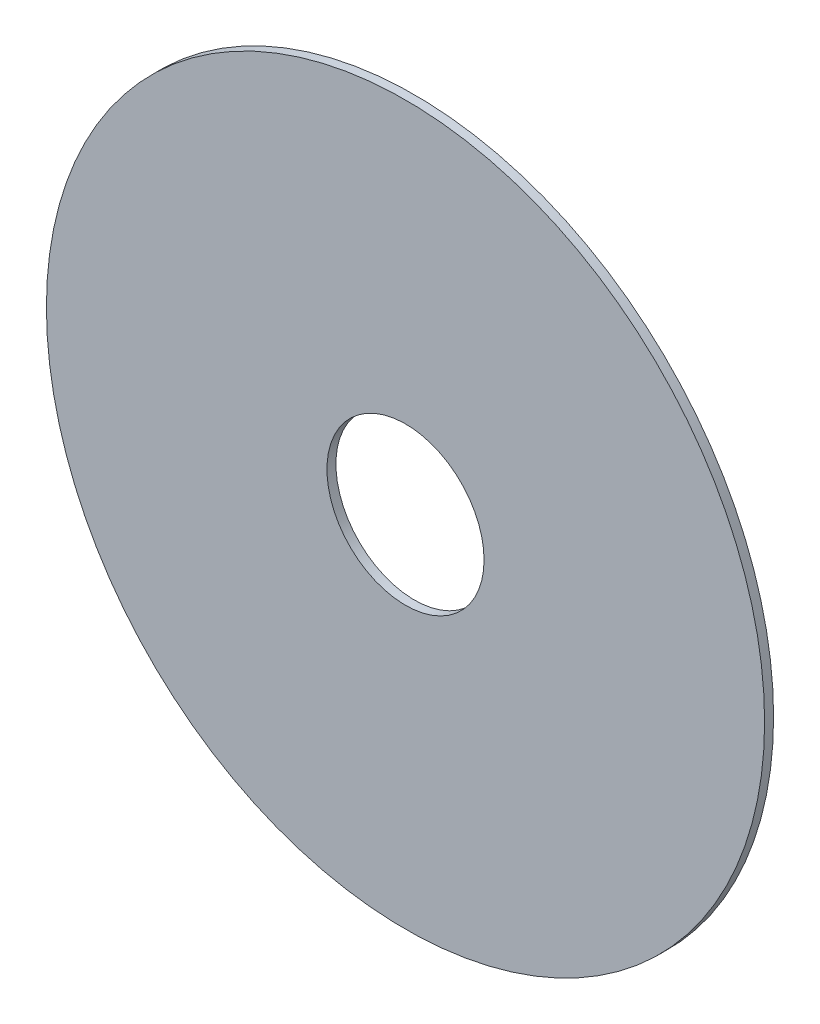
ISO-10303-21;
HEADER;
FILE_DESCRIPTION(('STEP AP214'),'2;1');
FILE_NAME('part.step','',(''),(''),'','','');
FILE_SCHEMA(('AUTOMOTIVE_DESIGN { 1 0 10303 214 1 1 1 1 }'));
ENDSEC;
DATA;
#1=APPLICATION_CONTEXT('core data for automotive mechanical design processes');
#2=APPLICATION_PROTOCOL_DEFINITION('international standard','automotive_design',2000,#1);
#3=PRODUCT_CONTEXT('',#1,'mechanical');
#4=PRODUCT('Part','Part','',(#3));
#5=PRODUCT_RELATED_PRODUCT_CATEGORY('part','',(#4));
#6=PRODUCT_DEFINITION_FORMATION('','',#4);
#7=PRODUCT_DEFINITION_CONTEXT('part definition',#1,'design');
#8=PRODUCT_DEFINITION('design','',#6,#7);
#9=PRODUCT_DEFINITION_SHAPE('','',#8);
#10=(LENGTH_UNIT() NAMED_UNIT(*) SI_UNIT(.MILLI.,.METRE.));
#11=(NAMED_UNIT(*) PLANE_ANGLE_UNIT() SI_UNIT($,.RADIAN.));
#12=(NAMED_UNIT(*) SI_UNIT($,.STERADIAN.) SOLID_ANGLE_UNIT());
#13=UNCERTAINTY_MEASURE_WITH_UNIT(LENGTH_MEASURE(1.E-05),#10,'distance_accuracy_value','');
#14=(GEOMETRIC_REPRESENTATION_CONTEXT(3) GLOBAL_UNCERTAINTY_ASSIGNED_CONTEXT((#13)) GLOBAL_UNIT_ASSIGNED_CONTEXT((#10,
#11,#12)) REPRESENTATION_CONTEXT('',''));
#15=CARTESIAN_POINT('',(0.,0.,0.));
#16=DIRECTION('',(0.,0.,1.));
#17=DIRECTION('',(1.,0.,0.));
#18=AXIS2_PLACEMENT_3D('',#15,#16,#17);
#19=CARTESIAN_POINT('',(0.,0.,2.));
#20=DIRECTION('',(0.,0.,-1.));
#21=DIRECTION('',(-1.,0.,0.));
#22=AXIS2_PLACEMENT_3D('',#19,#20,#21);
#23=CYLINDRICAL_SURFACE('',#22,80.);
#24=CARTESIAN_POINT('',(0.,0.,2.));
#25=DIRECTION('',(0.,0.,1.));
#26=DIRECTION('',(1.,0.,0.));
#27=AXIS2_PLACEMENT_3D('',#24,#25,#26);
#28=CIRCLE('',#27,80.);
#29=CARTESIAN_POINT('',(80.,0.,2.));
#30=VERTEX_POINT('',#29);
#31=EDGE_CURVE('E10',#30,#30,#28,.T.);
#32=ORIENTED_EDGE('',*,*,#31,.F.);
#33=EDGE_LOOP('',(#32));
#34=FACE_BOUND('',#33,.T.);
#35=CARTESIAN_POINT('',(0.,0.,0.));
#36=DIRECTION('',(0.,0.,1.));
#37=DIRECTION('',(1.,0.,0.));
#38=AXIS2_PLACEMENT_3D('',#35,#36,#37);
#39=CIRCLE('',#38,80.);
#40=CARTESIAN_POINT('',(80.,0.,0.));
#41=VERTEX_POINT('',#40);
#42=EDGE_CURVE('E37',#41,#41,#39,.T.);
#43=ORIENTED_EDGE('',*,*,#42,.T.);
#44=EDGE_LOOP('',(#43));
#45=FACE_BOUND('',#44,.T.);
#46=ADVANCED_FACE('F34',(#34,#45),#23,.T.);
#47=CARTESIAN_POINT('',(0.,0.,2.));
#48=DIRECTION('',(0.,0.,1.));
#49=DIRECTION('',(1.,0.,0.));
#50=AXIS2_PLACEMENT_3D('',#47,#48,#49);
#51=PLANE('',#50);
#52=CARTESIAN_POINT('',(0.,0.,2.));
#53=DIRECTION('',(0.,0.,1.));
#54=DIRECTION('',(1.,0.,0.));
#55=AXIS2_PLACEMENT_3D('',#52,#53,#54);
#56=CIRCLE('',#55,17.5);
#57=CARTESIAN_POINT('',(17.5,0.,2.));
#58=VERTEX_POINT('',#57);
#59=EDGE_CURVE('E46',#58,#58,#56,.T.);
#60=ORIENTED_EDGE('',*,*,#59,.F.);
#61=EDGE_LOOP('',(#60));
#62=FACE_BOUND('',#61,.T.);
#63=ORIENTED_EDGE('',*,*,#31,.T.);
#64=EDGE_LOOP('',(#63));
#65=FACE_BOUND('',#64,.T.);
#66=ADVANCED_FACE('F61',(#62,#65),#51,.T.);
#67=CARTESIAN_POINT('',(0.,0.,0.));
#68=DIRECTION('',(0.,0.,1.));
#69=DIRECTION('',(1.,0.,0.));
#70=AXIS2_PLACEMENT_3D('',#67,#68,#69);
#71=PLANE('',#70);
#72=CARTESIAN_POINT('',(0.,0.,0.));
#73=DIRECTION('',(0.,0.,1.));
#74=DIRECTION('',(1.,0.,0.));
#75=AXIS2_PLACEMENT_3D('',#72,#73,#74);
#76=CIRCLE('',#75,17.5);
#77=CARTESIAN_POINT('',(17.5,0.,0.));
#78=VERTEX_POINT('',#77);
#79=EDGE_CURVE('E44',#78,#78,#76,.T.);
#80=ORIENTED_EDGE('',*,*,#79,.T.);
#81=EDGE_LOOP('',(#80));
#82=FACE_BOUND('',#81,.T.);
#83=ORIENTED_EDGE('',*,*,#42,.F.);
#84=EDGE_LOOP('',(#83));
#85=FACE_BOUND('',#84,.T.);
#86=ADVANCED_FACE('F52',(#82,#85),#71,.F.);
#87=CARTESIAN_POINT('',(0.,0.,0.));
#88=DIRECTION('',(0.,0.,1.));
#89=DIRECTION('',(1.,0.,0.));
#90=AXIS2_PLACEMENT_3D('',#87,#88,#89);
#91=CYLINDRICAL_SURFACE('',#90,17.5);
#92=ORIENTED_EDGE('',*,*,#79,.F.);
#93=EDGE_LOOP('',(#92));
#94=FACE_BOUND('',#93,.T.);
#95=ORIENTED_EDGE('',*,*,#59,.T.);
#96=EDGE_LOOP('',(#95));
#97=FACE_BOUND('',#96,.T.);
#98=ADVANCED_FACE('F55',(#94,#97),#91,.F.);
#99=CLOSED_SHELL('',(#46,#66,#86,#98));
#100=MANIFOLD_SOLID_BREP('B2',#99);
#101=ADVANCED_BREP_SHAPE_REPRESENTATION('',(#18,#100),#14);
#102=SHAPE_DEFINITION_REPRESENTATION(#9,#101);
ENDSEC;
END-ISO-10303-21;
